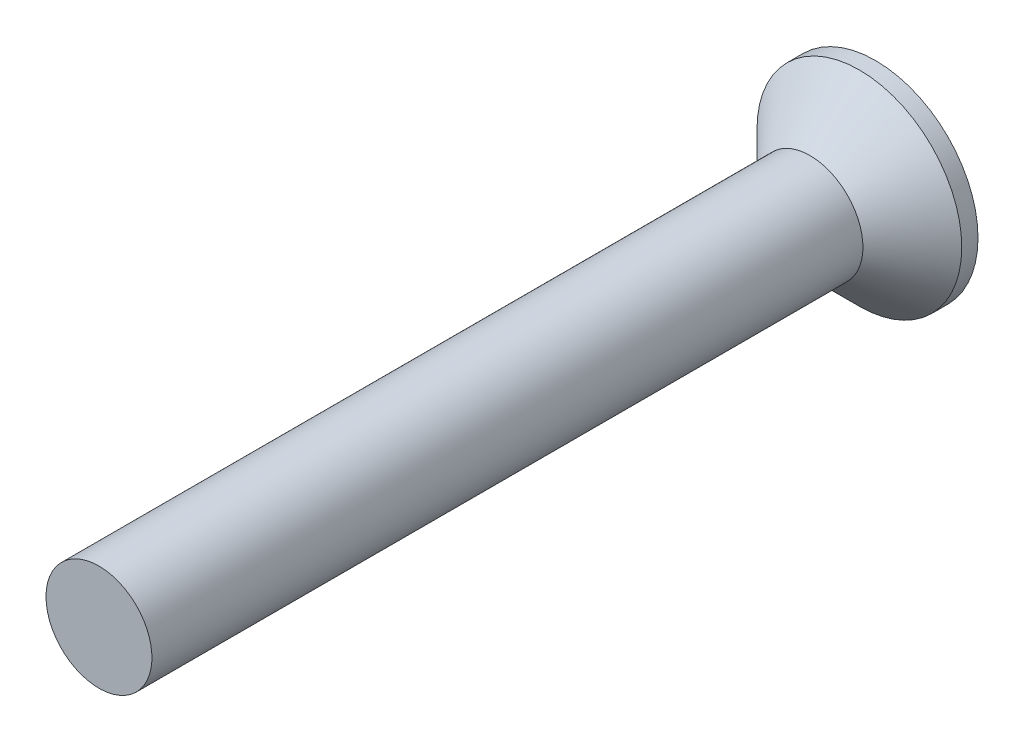
ISO-10303-21;
HEADER;
FILE_DESCRIPTION(('STEP AP214'),'2;1');
FILE_NAME('part.step','',(''),(''),'','','');
FILE_SCHEMA(('AUTOMOTIVE_DESIGN { 1 0 10303 214 1 1 1 1 }'));
ENDSEC;
DATA;
#1=APPLICATION_CONTEXT('core data for automotive mechanical design processes');
#2=APPLICATION_PROTOCOL_DEFINITION('international standard','automotive_design',2000,#1);
#3=PRODUCT_CONTEXT('',#1,'mechanical');
#4=PRODUCT('Part','Part','',(#3));
#5=PRODUCT_RELATED_PRODUCT_CATEGORY('part','',(#4));
#6=PRODUCT_DEFINITION_FORMATION('','',#4);
#7=PRODUCT_DEFINITION_CONTEXT('part definition',#1,'design');
#8=PRODUCT_DEFINITION('design','',#6,#7);
#9=PRODUCT_DEFINITION_SHAPE('','',#8);
#10=(LENGTH_UNIT() NAMED_UNIT(*) SI_UNIT(.MILLI.,.METRE.));
#11=(NAMED_UNIT(*) PLANE_ANGLE_UNIT() SI_UNIT($,.RADIAN.));
#12=(NAMED_UNIT(*) SI_UNIT($,.STERADIAN.) SOLID_ANGLE_UNIT());
#13=UNCERTAINTY_MEASURE_WITH_UNIT(LENGTH_MEASURE(1.E-05),#10,'distance_accuracy_value','');
#14=(GEOMETRIC_REPRESENTATION_CONTEXT(3) GLOBAL_UNCERTAINTY_ASSIGNED_CONTEXT((#13)) GLOBAL_UNIT_ASSIGNED_CONTEXT((#10,
#11,#12)) REPRESENTATION_CONTEXT('',''));
#15=CARTESIAN_POINT('',(0.,0.,0.));
#16=DIRECTION('',(0.,0.,1.));
#17=DIRECTION('',(1.,0.,0.));
#18=AXIS2_PLACEMENT_3D('',#15,#16,#17);
#19=CARTESIAN_POINT('',(0.,0.,0.));
#20=DIRECTION('',(0.,0.,-1.));
#21=DIRECTION('',(-1.,0.,0.));
#22=AXIS2_PLACEMENT_3D('',#19,#20,#21);
#23=PLANE('',#22);
#24=CARTESIAN_POINT('',(0.,0.,0.));
#25=DIRECTION('',(0.,0.,-1.));
#26=DIRECTION('',(-1.,0.,0.));
#27=AXIS2_PLACEMENT_3D('',#24,#25,#26);
#28=CIRCLE('',#27,1.5);
#29=CARTESIAN_POINT('',(-1.5,0.,0.));
#30=VERTEX_POINT('',#29);
#31=EDGE_CURVE('E11',#30,#30,#28,.T.);
#32=ORIENTED_EDGE('',*,*,#31,.F.);
#33=EDGE_LOOP('',(#32));
#34=FACE_BOUND('',#33,.T.);
#35=ADVANCED_FACE('F36',(#34),#23,.F.);
#36=CARTESIAN_POINT('',(0.,0.,-22.));
#37=DIRECTION('',(0.,0.,-1.));
#38=DIRECTION('',(-1.,0.,0.));
#39=AXIS2_PLACEMENT_3D('',#36,#37,#38);
#40=CYLINDRICAL_SURFACE('',#39,1.5);
#41=CARTESIAN_POINT('',(0.,0.,-20.14));
#42=DIRECTION('',(0.,0.,-1.));
#43=DIRECTION('',(-1.,0.,0.));
#44=AXIS2_PLACEMENT_3D('',#41,#42,#43);
#45=CIRCLE('',#44,1.5);
#46=CARTESIAN_POINT('',(-1.5,0.,-20.14));
#47=VERTEX_POINT('',#46);
#48=EDGE_CURVE('E43',#47,#47,#45,.T.);
#49=ORIENTED_EDGE('',*,*,#48,.F.);
#50=EDGE_LOOP('',(#49));
#51=FACE_BOUND('',#50,.T.);
#52=ORIENTED_EDGE('',*,*,#31,.T.);
#53=EDGE_LOOP('',(#52));
#54=FACE_BOUND('',#53,.T.);
#55=ADVANCED_FACE('F152',(#51,#54),#40,.T.);
#56=CARTESIAN_POINT('',(0.,0.,-20.14));
#57=DIRECTION('',(0.,0.,-1.));
#58=DIRECTION('',(-1.,0.,0.));
#59=AXIS2_PLACEMENT_3D('',#56,#57,#58);
#60=CONICAL_SURFACE('',#59,1.5,0.78539816339745);
#61=CARTESIAN_POINT('',(0.,0.,-21.54));
#62=DIRECTION('',(0.,0.,-1.));
#63=DIRECTION('',(-1.,0.,0.));
#64=AXIS2_PLACEMENT_3D('',#61,#62,#63);
#65=CIRCLE('',#64,2.9);
#66=CARTESIAN_POINT('',(-2.9,0.,-21.54));
#67=VERTEX_POINT('',#66);
#68=EDGE_CURVE('E145',#67,#67,#65,.T.);
#69=ORIENTED_EDGE('',*,*,#68,.F.);
#70=EDGE_LOOP('',(#69));
#71=FACE_BOUND('',#70,.T.);
#72=ORIENTED_EDGE('',*,*,#48,.T.);
#73=EDGE_LOOP('',(#72));
#74=FACE_BOUND('',#73,.T.);
#75=ADVANCED_FACE('F150',(#71,#74),#60,.T.);
#76=CARTESIAN_POINT('',(0.,0.,-22.));
#77=DIRECTION('',(0.,0.,-1.));
#78=DIRECTION('',(-1.,0.,0.));
#79=AXIS2_PLACEMENT_3D('',#76,#77,#78);
#80=CYLINDRICAL_SURFACE('',#79,2.9);
#81=CARTESIAN_POINT('',(0.,0.,-22.));
#82=DIRECTION('',(0.,0.,-1.));
#83=DIRECTION('',(-1.,0.,0.));
#84=AXIS2_PLACEMENT_3D('',#81,#82,#83);
#85=CIRCLE('',#84,2.9);
#86=CARTESIAN_POINT('',(-2.9,0.,-22.));
#87=VERTEX_POINT('',#86);
#88=EDGE_CURVE('E137',#87,#87,#85,.T.);
#89=ORIENTED_EDGE('',*,*,#88,.F.);
#90=EDGE_LOOP('',(#89));
#91=FACE_BOUND('',#90,.T.);
#92=ORIENTED_EDGE('',*,*,#68,.T.);
#93=EDGE_LOOP('',(#92));
#94=FACE_BOUND('',#93,.T.);
#95=ADVANCED_FACE('F170',(#91,#94),#80,.T.);
#96=CARTESIAN_POINT('',(2.9,0.,-22.));
#97=DIRECTION('',(0.,0.,1.));
#98=DIRECTION('',(1.,0.,0.));
#99=AXIS2_PLACEMENT_3D('',#96,#97,#98);
#100=PLANE('',#99);
#101=DIRECTION('',(-1.,0.,0.));
#102=VECTOR('',#101,1.);
#103=CARTESIAN_POINT('',(0.721687836487031,-1.25,-22.));
#104=LINE('',#103,#102);
#105=CARTESIAN_POINT('',(0.721687836487031,-1.25,-22.));
#106=VERTEX_POINT('',#105);
#107=CARTESIAN_POINT('',(-0.721687836487034,-1.25,-22.));
#108=VERTEX_POINT('',#107);
#109=EDGE_CURVE('E124',#106,#108,#104,.T.);
#110=ORIENTED_EDGE('',*,*,#109,.F.);
#111=DIRECTION('',(-0.5,-0.866025403784439,0.));
#112=VECTOR('',#111,1.);
#113=CARTESIAN_POINT('',(1.44337567297406,0.,-22.));
#114=LINE('',#113,#112);
#115=CARTESIAN_POINT('',(1.44337567297406,0.,-22.));
#116=VERTEX_POINT('',#115);
#117=EDGE_CURVE('E50',#116,#106,#114,.T.);
#118=ORIENTED_EDGE('',*,*,#117,.F.);
#119=DIRECTION('',(0.5,-0.866025403784439,0.));
#120=VECTOR('',#119,1.);
#121=CARTESIAN_POINT('',(0.721687836487031,1.25,-22.));
#122=LINE('',#121,#120);
#123=CARTESIAN_POINT('',(0.721687836487031,1.25,-22.));
#124=VERTEX_POINT('',#123);
#125=EDGE_CURVE('E133',#124,#116,#122,.T.);
#126=ORIENTED_EDGE('',*,*,#125,.F.);
#127=DIRECTION('',(1.,0.,0.));
#128=VECTOR('',#127,1.);
#129=CARTESIAN_POINT('',(-0.721687836487033,1.25,-22.));
#130=LINE('',#129,#128);
#131=CARTESIAN_POINT('',(-0.721687836487033,1.25,-22.));
#132=VERTEX_POINT('',#131);
#133=EDGE_CURVE('E131',#132,#124,#130,.T.);
#134=ORIENTED_EDGE('',*,*,#133,.F.);
#135=DIRECTION('',(0.500000000000001,0.866025403784438,0.));
#136=VECTOR('',#135,1.);
#137=CARTESIAN_POINT('',(-1.44337567297407,0.,-22.));
#138=LINE('',#137,#136);
#139=CARTESIAN_POINT('',(-1.44337567297407,0.,-22.));
#140=VERTEX_POINT('',#139);
#141=EDGE_CURVE('E98',#140,#132,#138,.T.);
#142=ORIENTED_EDGE('',*,*,#141,.F.);
#143=DIRECTION('',(-0.5,0.866025403784439,0.));
#144=VECTOR('',#143,1.);
#145=CARTESIAN_POINT('',(-0.721687836487034,-1.25,-22.));
#146=LINE('',#145,#144);
#147=EDGE_CURVE('E127',#108,#140,#146,.T.);
#148=ORIENTED_EDGE('',*,*,#147,.F.);
#149=EDGE_LOOP('',(#110,#118,#126,#134,#142,#148));
#150=FACE_BOUND('',#149,.T.);
#151=ORIENTED_EDGE('',*,*,#88,.T.);
#152=EDGE_LOOP('',(#151));
#153=FACE_BOUND('',#152,.T.);
#154=ADVANCED_FACE('F178',(#150,#153),#100,.F.);
#155=CARTESIAN_POINT('',(1.44337567297406,0.,-20.));
#156=DIRECTION('',(0.866025403784439,-0.5,0.));
#157=DIRECTION('',(0.5,0.866025403784439,0.));
#158=AXIS2_PLACEMENT_3D('',#155,#156,#157);
#159=PLANE('',#158);
#160=ORIENTED_EDGE('',*,*,#117,.T.);
#161=DIRECTION('',(0.,0.,-1.));
#162=VECTOR('',#161,1.);
#163=CARTESIAN_POINT('',(0.721687836487031,-1.25,-20.));
#164=LINE('',#163,#162);
#165=CARTESIAN_POINT('',(0.721687836487031,-1.25,-20.));
#166=VERTEX_POINT('',#165);
#167=EDGE_CURVE('E80',#166,#106,#164,.T.);
#168=ORIENTED_EDGE('',*,*,#167,.F.);
#169=DIRECTION('',(-0.5,-0.866025403784439,0.));
#170=VECTOR('',#169,1.);
#171=CARTESIAN_POINT('',(1.44337567297406,0.,-20.));
#172=LINE('',#171,#170);
#173=CARTESIAN_POINT('',(1.44337567297406,0.,-20.));
#174=VERTEX_POINT('',#173);
#175=EDGE_CURVE('E135',#174,#166,#172,.T.);
#176=ORIENTED_EDGE('',*,*,#175,.F.);
#177=DIRECTION('',(0.,0.,-1.));
#178=VECTOR('',#177,1.);
#179=CARTESIAN_POINT('',(1.44337567297406,0.,-20.));
#180=LINE('',#179,#178);
#181=EDGE_CURVE('E58',#174,#116,#180,.T.);
#182=ORIENTED_EDGE('',*,*,#181,.T.);
#183=EDGE_LOOP('',(#160,#168,#176,#182));
#184=FACE_BOUND('',#183,.T.);
#185=ADVANCED_FACE('F186',(#184),#159,.F.);
#186=CARTESIAN_POINT('',(0.721687836487031,1.25,-20.));
#187=DIRECTION('',(0.866025403784439,0.5,0.));
#188=DIRECTION('',(-0.5,0.866025403784439,0.));
#189=AXIS2_PLACEMENT_3D('',#186,#187,#188);
#190=PLANE('',#189);
#191=ORIENTED_EDGE('',*,*,#125,.T.);
#192=ORIENTED_EDGE('',*,*,#181,.F.);
#193=DIRECTION('',(0.5,-0.866025403784439,0.));
#194=VECTOR('',#193,1.);
#195=CARTESIAN_POINT('',(0.721687836487031,1.25,-20.));
#196=LINE('',#195,#194);
#197=CARTESIAN_POINT('',(0.721687836487031,1.25,-20.));
#198=VERTEX_POINT('',#197);
#199=EDGE_CURVE('E110',#198,#174,#196,.T.);
#200=ORIENTED_EDGE('',*,*,#199,.F.);
#201=DIRECTION('',(0.,0.,-1.));
#202=VECTOR('',#201,1.);
#203=CARTESIAN_POINT('',(0.721687836487031,1.25,-20.));
#204=LINE('',#203,#202);
#205=EDGE_CURVE('E102',#198,#124,#204,.T.);
#206=ORIENTED_EDGE('',*,*,#205,.T.);
#207=EDGE_LOOP('',(#191,#192,#200,#206));
#208=FACE_BOUND('',#207,.T.);
#209=ADVANCED_FACE('F194',(#208),#190,.F.);
#210=CARTESIAN_POINT('',(-0.721687836487033,1.25,-20.));
#211=DIRECTION('',(0.,1.,0.));
#212=DIRECTION('',(-1.,0.,0.));
#213=AXIS2_PLACEMENT_3D('',#210,#211,#212);
#214=PLANE('',#213);
#215=ORIENTED_EDGE('',*,*,#133,.T.);
#216=ORIENTED_EDGE('',*,*,#205,.F.);
#217=DIRECTION('',(1.,0.,0.));
#218=VECTOR('',#217,1.);
#219=CARTESIAN_POINT('',(-0.721687836487033,1.25,-20.));
#220=LINE('',#219,#218);
#221=CARTESIAN_POINT('',(-0.721687836487033,1.25,-20.));
#222=VERTEX_POINT('',#221);
#223=EDGE_CURVE('E106',#222,#198,#220,.T.);
#224=ORIENTED_EDGE('',*,*,#223,.F.);
#225=DIRECTION('',(0.,0.,-1.));
#226=VECTOR('',#225,1.);
#227=CARTESIAN_POINT('',(-0.721687836487033,1.25,-20.));
#228=LINE('',#227,#226);
#229=EDGE_CURVE('E91',#222,#132,#228,.T.);
#230=ORIENTED_EDGE('',*,*,#229,.T.);
#231=EDGE_LOOP('',(#215,#216,#224,#230));
#232=FACE_BOUND('',#231,.T.);
#233=ADVANCED_FACE('F107',(#232),#214,.F.);
#234=CARTESIAN_POINT('',(-1.44337567297407,0.,-20.));
#235=DIRECTION('',(-0.866025403784438,0.500000000000001,0.));
#236=DIRECTION('',(-0.500000000000001,-0.866025403784438,0.));
#237=AXIS2_PLACEMENT_3D('',#234,#235,#236);
#238=PLANE('',#237);
#239=ORIENTED_EDGE('',*,*,#141,.T.);
#240=ORIENTED_EDGE('',*,*,#229,.F.);
#241=DIRECTION('',(0.500000000000001,0.866025403784438,0.));
#242=VECTOR('',#241,1.);
#243=CARTESIAN_POINT('',(-1.44337567297407,0.,-20.));
#244=LINE('',#243,#242);
#245=CARTESIAN_POINT('',(-1.44337567297407,0.,-20.));
#246=VERTEX_POINT('',#245);
#247=EDGE_CURVE('E95',#246,#222,#244,.T.);
#248=ORIENTED_EDGE('',*,*,#247,.F.);
#249=DIRECTION('',(0.,0.,-1.));
#250=VECTOR('',#249,1.);
#251=CARTESIAN_POINT('',(-1.44337567297407,0.,-20.));
#252=LINE('',#251,#250);
#253=EDGE_CURVE('E103',#246,#140,#252,.T.);
#254=ORIENTED_EDGE('',*,*,#253,.T.);
#255=EDGE_LOOP('',(#239,#240,#248,#254));
#256=FACE_BOUND('',#255,.T.);
#257=ADVANCED_FACE('F93',(#256),#238,.F.);
#258=CARTESIAN_POINT('',(-0.721687836487034,-1.25,-20.));
#259=DIRECTION('',(-0.866025403784439,-0.5,0.));
#260=DIRECTION('',(0.5,-0.866025403784439,0.));
#261=AXIS2_PLACEMENT_3D('',#258,#259,#260);
#262=PLANE('',#261);
#263=ORIENTED_EDGE('',*,*,#147,.T.);
#264=ORIENTED_EDGE('',*,*,#253,.F.);
#265=DIRECTION('',(-0.5,0.866025403784439,0.));
#266=VECTOR('',#265,1.);
#267=CARTESIAN_POINT('',(-0.721687836487034,-1.25,-20.));
#268=LINE('',#267,#266);
#269=CARTESIAN_POINT('',(-0.721687836487034,-1.25,-20.));
#270=VERTEX_POINT('',#269);
#271=EDGE_CURVE('E116',#270,#246,#268,.T.);
#272=ORIENTED_EDGE('',*,*,#271,.F.);
#273=DIRECTION('',(0.,0.,-1.));
#274=VECTOR('',#273,1.);
#275=CARTESIAN_POINT('',(-0.721687836487034,-1.25,-20.));
#276=LINE('',#275,#274);
#277=EDGE_CURVE('E140',#270,#108,#276,.T.);
#278=ORIENTED_EDGE('',*,*,#277,.T.);
#279=EDGE_LOOP('',(#263,#264,#272,#278));
#280=FACE_BOUND('',#279,.T.);
#281=ADVANCED_FACE('F213',(#280),#262,.F.);
#282=CARTESIAN_POINT('',(0.721687836487031,-1.25,-20.));
#283=DIRECTION('',(0.,-1.,0.));
#284=DIRECTION('',(1.,0.,0.));
#285=AXIS2_PLACEMENT_3D('',#282,#283,#284);
#286=PLANE('',#285);
#287=ORIENTED_EDGE('',*,*,#109,.T.);
#288=ORIENTED_EDGE('',*,*,#277,.F.);
#289=DIRECTION('',(-1.,0.,0.));
#290=VECTOR('',#289,1.);
#291=CARTESIAN_POINT('',(0.721687836487031,-1.25,-20.));
#292=LINE('',#291,#290);
#293=EDGE_CURVE('E118',#166,#270,#292,.T.);
#294=ORIENTED_EDGE('',*,*,#293,.F.);
#295=ORIENTED_EDGE('',*,*,#167,.T.);
#296=EDGE_LOOP('',(#287,#288,#294,#295));
#297=FACE_BOUND('',#296,.T.);
#298=ADVANCED_FACE('F220',(#297),#286,.F.);
#299=CARTESIAN_POINT('',(0.,0.,-20.));
#300=DIRECTION('',(0.,0.,-1.));
#301=DIRECTION('',(-1.,0.,0.));
#302=AXIS2_PLACEMENT_3D('',#299,#300,#301);
#303=PLANE('',#302);
#304=ORIENTED_EDGE('',*,*,#175,.T.);
#305=ORIENTED_EDGE('',*,*,#293,.T.);
#306=ORIENTED_EDGE('',*,*,#271,.T.);
#307=ORIENTED_EDGE('',*,*,#247,.T.);
#308=ORIENTED_EDGE('',*,*,#223,.T.);
#309=ORIENTED_EDGE('',*,*,#199,.T.);
#310=EDGE_LOOP('',(#304,#305,#306,#307,#308,#309));
#311=FACE_BOUND('',#310,.T.);
#312=ADVANCED_FACE('F113',(#311),#303,.T.);
#313=CLOSED_SHELL('',(#35,#55,#75,#95,#154,#185,#209,#233,#257,#281,#298,#312));
#314=MANIFOLD_SOLID_BREP('B2',#313);
#315=ADVANCED_BREP_SHAPE_REPRESENTATION('',(#18,#314),#14);
#316=SHAPE_DEFINITION_REPRESENTATION(#9,#315);
ENDSEC;
END-ISO-10303-21;
